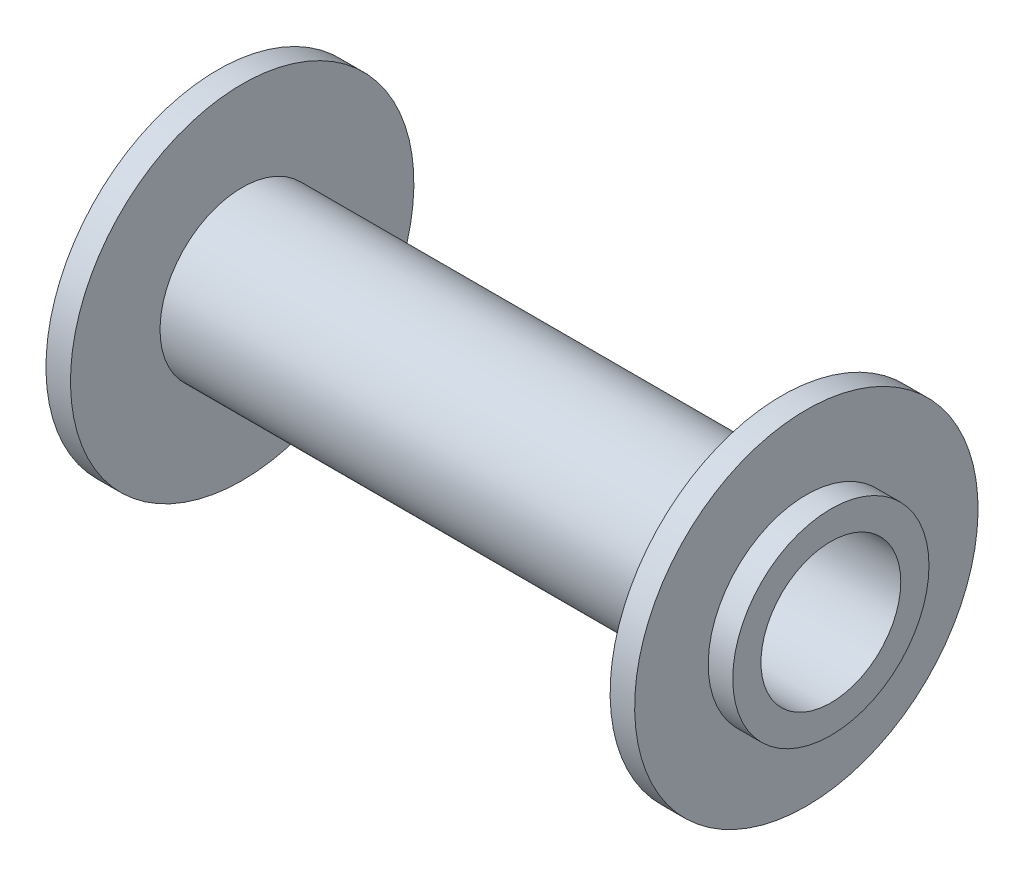
ISO-10303-21;
HEADER;
FILE_DESCRIPTION(('STEP AP214'),'2;1');
FILE_NAME('part.step','',(''),(''),'','','');
FILE_SCHEMA(('AUTOMOTIVE_DESIGN { 1 0 10303 214 1 1 1 1 }'));
ENDSEC;
DATA;
#1=APPLICATION_CONTEXT('core data for automotive mechanical design processes');
#2=APPLICATION_PROTOCOL_DEFINITION('international standard','automotive_design',2000,#1);
#3=PRODUCT_CONTEXT('',#1,'mechanical');
#4=PRODUCT('Part','Part','',(#3));
#5=PRODUCT_RELATED_PRODUCT_CATEGORY('part','',(#4));
#6=PRODUCT_DEFINITION_FORMATION('','',#4);
#7=PRODUCT_DEFINITION_CONTEXT('part definition',#1,'design');
#8=PRODUCT_DEFINITION('design','',#6,#7);
#9=PRODUCT_DEFINITION_SHAPE('','',#8);
#10=(LENGTH_UNIT() NAMED_UNIT(*) SI_UNIT(.MILLI.,.METRE.));
#11=(NAMED_UNIT(*) PLANE_ANGLE_UNIT() SI_UNIT($,.RADIAN.));
#12=(NAMED_UNIT(*) SI_UNIT($,.STERADIAN.) SOLID_ANGLE_UNIT());
#13=UNCERTAINTY_MEASURE_WITH_UNIT(LENGTH_MEASURE(1.E-05),#10,'distance_accuracy_value','');
#14=(GEOMETRIC_REPRESENTATION_CONTEXT(3) GLOBAL_UNCERTAINTY_ASSIGNED_CONTEXT((#13)) GLOBAL_UNIT_ASSIGNED_CONTEXT((#10,
#11,#12)) REPRESENTATION_CONTEXT('',''));
#15=CARTESIAN_POINT('',(0.,0.,0.));
#16=DIRECTION('',(0.,0.,1.));
#17=DIRECTION('',(1.,0.,0.));
#18=AXIS2_PLACEMENT_3D('',#15,#16,#17);
#19=CARTESIAN_POINT('',(-24.,0.,0.));
#20=DIRECTION('',(1.,0.,0.));
#21=DIRECTION('',(0.,1.,0.));
#22=AXIS2_PLACEMENT_3D('',#19,#20,#21);
#23=PLANE('',#22);
#24=CARTESIAN_POINT('',(-24.,0.,0.));
#25=DIRECTION('',(-1.,0.,0.));
#26=DIRECTION('',(0.,-1.,0.));
#27=AXIS2_PLACEMENT_3D('',#24,#25,#26);
#28=CIRCLE('',#27,14.);
#29=CARTESIAN_POINT('',(-24.,-14.,0.));
#30=VERTEX_POINT('',#29);
#31=EDGE_CURVE('E40',#30,#30,#28,.T.);
#32=ORIENTED_EDGE('',*,*,#31,.T.);
#33=EDGE_LOOP('',(#32));
#34=FACE_BOUND('',#33,.T.);
#35=CARTESIAN_POINT('',(-24.,0.,0.));
#36=DIRECTION('',(1.,0.,0.));
#37=DIRECTION('',(0.,1.,0.));
#38=AXIS2_PLACEMENT_3D('',#35,#36,#37);
#39=CIRCLE('',#38,8.);
#40=CARTESIAN_POINT('',(-24.,8.,0.));
#41=VERTEX_POINT('',#40);
#42=EDGE_CURVE('E10',#41,#41,#39,.F.);
#43=ORIENTED_EDGE('',*,*,#42,.F.);
#44=EDGE_LOOP('',(#43));
#45=FACE_BOUND('',#44,.T.);
#46=ADVANCED_FACE('F30',(#34,#45),#23,.F.);
#47=CARTESIAN_POINT('',(24.,0.,0.));
#48=DIRECTION('',(-1.,0.,0.));
#49=DIRECTION('',(0.,-1.,0.));
#50=AXIS2_PLACEMENT_3D('',#47,#48,#49);
#51=PLANE('',#50);
#52=CARTESIAN_POINT('',(24.,0.,0.));
#53=DIRECTION('',(-1.,0.,0.));
#54=DIRECTION('',(0.,-1.,0.));
#55=AXIS2_PLACEMENT_3D('',#52,#53,#54);
#56=CIRCLE('',#55,14.);
#57=CARTESIAN_POINT('',(24.,-14.,0.));
#58=VERTEX_POINT('',#57);
#59=EDGE_CURVE('E58',#58,#58,#56,.T.);
#60=ORIENTED_EDGE('',*,*,#59,.F.);
#61=EDGE_LOOP('',(#60));
#62=FACE_BOUND('',#61,.T.);
#63=CARTESIAN_POINT('',(24.,0.,0.));
#64=DIRECTION('',(-1.,0.,0.));
#65=DIRECTION('',(0.,-1.,0.));
#66=AXIS2_PLACEMENT_3D('',#63,#64,#65);
#67=CIRCLE('',#66,8.);
#68=CARTESIAN_POINT('',(24.,-8.,0.));
#69=VERTEX_POINT('',#68);
#70=EDGE_CURVE('E36',#69,#69,#67,.F.);
#71=ORIENTED_EDGE('',*,*,#70,.F.);
#72=EDGE_LOOP('',(#71));
#73=FACE_BOUND('',#72,.T.);
#74=ADVANCED_FACE('F92',(#62,#73),#51,.F.);
#75=CARTESIAN_POINT('',(-24.,0.,0.));
#76=DIRECTION('',(-1.,0.,0.));
#77=DIRECTION('',(0.,-1.,0.));
#78=AXIS2_PLACEMENT_3D('',#75,#76,#77);
#79=CYLINDRICAL_SURFACE('',#78,14.);
#80=ORIENTED_EDGE('',*,*,#31,.F.);
#81=EDGE_LOOP('',(#80));
#82=FACE_BOUND('',#81,.T.);
#83=CARTESIAN_POINT('',(-22.,0.,0.));
#84=DIRECTION('',(-1.,0.,0.));
#85=DIRECTION('',(0.,-1.,0.));
#86=AXIS2_PLACEMENT_3D('',#83,#84,#85);
#87=CIRCLE('',#86,14.);
#88=CARTESIAN_POINT('',(-22.,-14.,0.));
#89=VERTEX_POINT('',#88);
#90=EDGE_CURVE('E44',#89,#89,#87,.T.);
#91=ORIENTED_EDGE('',*,*,#90,.T.);
#92=EDGE_LOOP('',(#91));
#93=FACE_BOUND('',#92,.T.);
#94=ADVANCED_FACE('F97',(#82,#93),#79,.T.);
#95=CARTESIAN_POINT('',(-22.,14.,0.));
#96=DIRECTION('',(-1.,0.,0.));
#97=DIRECTION('',(0.,-1.,0.));
#98=AXIS2_PLACEMENT_3D('',#95,#96,#97);
#99=PLANE('',#98);
#100=ORIENTED_EDGE('',*,*,#90,.F.);
#101=EDGE_LOOP('',(#100));
#102=FACE_BOUND('',#101,.T.);
#103=CARTESIAN_POINT('',(-22.,0.,0.));
#104=DIRECTION('',(-1.,0.,0.));
#105=DIRECTION('',(0.,-1.,0.));
#106=AXIS2_PLACEMENT_3D('',#103,#104,#105);
#107=CIRCLE('',#106,6.7);
#108=CARTESIAN_POINT('',(-22.,-6.7,0.));
#109=VERTEX_POINT('',#108);
#110=EDGE_CURVE('E49',#109,#109,#107,.T.);
#111=ORIENTED_EDGE('',*,*,#110,.T.);
#112=EDGE_LOOP('',(#111));
#113=FACE_BOUND('',#112,.T.);
#114=ADVANCED_FACE('F105',(#102,#113),#99,.F.);
#115=CARTESIAN_POINT('',(-24.,0.,0.));
#116=DIRECTION('',(-1.,0.,0.));
#117=DIRECTION('',(0.,-1.,0.));
#118=AXIS2_PLACEMENT_3D('',#115,#116,#117);
#119=CYLINDRICAL_SURFACE('',#118,6.7);
#120=ORIENTED_EDGE('',*,*,#110,.F.);
#121=EDGE_LOOP('',(#120));
#122=FACE_BOUND('',#121,.T.);
#123=CARTESIAN_POINT('',(21.9999999999999,0.,0.));
#124=DIRECTION('',(-1.,0.,0.));
#125=DIRECTION('',(0.,-1.,0.));
#126=AXIS2_PLACEMENT_3D('',#123,#124,#125);
#127=CIRCLE('',#126,6.7);
#128=CARTESIAN_POINT('',(21.9999999999999,-6.69999999999999,0.));
#129=VERTEX_POINT('',#128);
#130=EDGE_CURVE('E52',#129,#129,#127,.T.);
#131=ORIENTED_EDGE('',*,*,#130,.T.);
#132=EDGE_LOOP('',(#131));
#133=FACE_BOUND('',#132,.T.);
#134=ADVANCED_FACE('F110',(#122,#133),#119,.T.);
#135=CARTESIAN_POINT('',(22.,14.,0.));
#136=DIRECTION('',(1.,0.,0.));
#137=DIRECTION('',(0.,1.,0.));
#138=AXIS2_PLACEMENT_3D('',#135,#136,#137);
#139=PLANE('',#138);
#140=ORIENTED_EDGE('',*,*,#130,.F.);
#141=EDGE_LOOP('',(#140));
#142=FACE_BOUND('',#141,.T.);
#143=CARTESIAN_POINT('',(21.9999999999999,0.,0.));
#144=DIRECTION('',(-1.,0.,0.));
#145=DIRECTION('',(0.,-1.,0.));
#146=AXIS2_PLACEMENT_3D('',#143,#144,#145);
#147=CIRCLE('',#146,14.);
#148=CARTESIAN_POINT('',(21.9999999999999,-14.,0.));
#149=VERTEX_POINT('',#148);
#150=EDGE_CURVE('E55',#149,#149,#147,.T.);
#151=ORIENTED_EDGE('',*,*,#150,.T.);
#152=EDGE_LOOP('',(#151));
#153=FACE_BOUND('',#152,.T.);
#154=ADVANCED_FACE('F116',(#142,#153),#139,.F.);
#155=CARTESIAN_POINT('',(-24.,0.,0.));
#156=DIRECTION('',(-1.,0.,0.));
#157=DIRECTION('',(0.,-1.,0.));
#158=AXIS2_PLACEMENT_3D('',#155,#156,#157);
#159=CYLINDRICAL_SURFACE('',#158,14.);
#160=ORIENTED_EDGE('',*,*,#150,.F.);
#161=EDGE_LOOP('',(#160));
#162=FACE_BOUND('',#161,.T.);
#163=ORIENTED_EDGE('',*,*,#59,.T.);
#164=EDGE_LOOP('',(#163));
#165=FACE_BOUND('',#164,.T.);
#166=ADVANCED_FACE('F122',(#162,#165),#159,.T.);
#167=CARTESIAN_POINT('',(-24.,0.,0.));
#168=DIRECTION('',(1.,0.,0.));
#169=DIRECTION('',(0.,0.,-1.));
#170=AXIS2_PLACEMENT_3D('',#167,#168,#169);
#171=CYLINDRICAL_SURFACE('',#170,5.7);
#172=CARTESIAN_POINT('',(26.,0.,0.));
#173=DIRECTION('',(1.,0.,0.));
#174=DIRECTION('',(0.,0.,-1.));
#175=AXIS2_PLACEMENT_3D('',#172,#173,#174);
#176=CIRCLE('',#175,5.7);
#177=CARTESIAN_POINT('',(26.,0.,-5.7));
#178=VERTEX_POINT('',#177);
#179=EDGE_CURVE('E64',#178,#178,#176,.T.);
#180=CARTESIAN_POINT('',(-26.,0.,0.));
#181=DIRECTION('',(-1.,0.,0.));
#182=DIRECTION('',(0.,0.,1.));
#183=AXIS2_PLACEMENT_3D('',#180,#181,#182);
#184=CIRCLE('',#183,5.7);
#185=CARTESIAN_POINT('',(-26.,0.,-5.7));
#186=VERTEX_POINT('',#185);
#187=EDGE_CURVE('E70',#186,#186,#184,.T.);
#188=CARTESIAN_POINT('',(26.,0.,-5.7));
#189=CARTESIAN_POINT('',(25.4583333333333,0.,-5.7));
#190=CARTESIAN_POINT('',(24.9166666666667,0.,-5.7));
#191=CARTESIAN_POINT('',(23.8333333333333,0.,-5.7));
#192=CARTESIAN_POINT('',(23.2916666666667,0.,-5.7));
#193=CARTESIAN_POINT('',(22.2083333333333,0.,-5.7));
#194=CARTESIAN_POINT('',(21.6666666666667,0.,-5.7));
#195=CARTESIAN_POINT('',(20.5833333333333,0.,-5.7));
#196=CARTESIAN_POINT('',(20.0416666666667,0.,-5.7));
#197=CARTESIAN_POINT('',(18.9583333333333,0.,-5.7));
#198=CARTESIAN_POINT('',(18.4166666666667,0.,-5.7));
#199=CARTESIAN_POINT('',(17.3333333333333,0.,-5.7));
#200=CARTESIAN_POINT('',(16.7916666666667,0.,-5.7));
#201=CARTESIAN_POINT('',(15.7083333333333,0.,-5.7));
#202=CARTESIAN_POINT('',(15.1666666666667,0.,-5.7));
#203=CARTESIAN_POINT('',(14.0833333333333,0.,-5.7));
#204=CARTESIAN_POINT('',(13.5416666666667,0.,-5.7));
#205=CARTESIAN_POINT('',(12.4583333333333,0.,-5.7));
#206=CARTESIAN_POINT('',(11.9166666666667,0.,-5.7));
#207=CARTESIAN_POINT('',(10.8333333333333,0.,-5.7));
#208=CARTESIAN_POINT('',(10.2916666666667,0.,-5.7));
#209=CARTESIAN_POINT('',(9.20833333333334,0.,-5.7));
#210=CARTESIAN_POINT('',(8.66666666666667,0.,-5.7));
#211=CARTESIAN_POINT('',(7.58333333333334,0.,-5.7));
#212=CARTESIAN_POINT('',(7.04166666666667,0.,-5.7));
#213=CARTESIAN_POINT('',(5.95833333333334,0.,-5.7));
#214=CARTESIAN_POINT('',(5.41666666666667,0.,-5.7));
#215=CARTESIAN_POINT('',(4.33333333333334,0.,-5.7));
#216=CARTESIAN_POINT('',(3.79166666666667,0.,-5.7));
#217=CARTESIAN_POINT('',(2.70833333333334,0.,-5.7));
#218=CARTESIAN_POINT('',(2.16666666666667,0.,-5.7));
#219=CARTESIAN_POINT('',(1.08333333333334,0.,-5.7));
#220=CARTESIAN_POINT('',(0.54166666666667,0.,-5.7));
#221=CARTESIAN_POINT('',(-0.541666666666664,0.,-5.7));
#222=CARTESIAN_POINT('',(-1.08333333333333,0.,-5.7));
#223=CARTESIAN_POINT('',(-2.16666666666666,0.,-5.7));
#224=CARTESIAN_POINT('',(-2.70833333333333,0.,-5.7));
#225=CARTESIAN_POINT('',(-3.79166666666666,0.,-5.7));
#226=CARTESIAN_POINT('',(-4.33333333333333,0.,-5.7));
#227=CARTESIAN_POINT('',(-5.41666666666666,0.,-5.7));
#228=CARTESIAN_POINT('',(-5.95833333333333,0.,-5.7));
#229=CARTESIAN_POINT('',(-7.04166666666667,0.,-5.7));
#230=CARTESIAN_POINT('',(-7.58333333333333,0.,-5.7));
#231=CARTESIAN_POINT('',(-8.66666666666667,0.,-5.7));
#232=CARTESIAN_POINT('',(-9.20833333333333,0.,-5.7));
#233=CARTESIAN_POINT('',(-10.2916666666667,0.,-5.7));
#234=CARTESIAN_POINT('',(-10.8333333333333,0.,-5.7));
#235=CARTESIAN_POINT('',(-11.9166666666667,0.,-5.7));
#236=CARTESIAN_POINT('',(-12.4583333333333,0.,-5.7));
#237=CARTESIAN_POINT('',(-13.5416666666667,0.,-5.7));
#238=CARTESIAN_POINT('',(-14.0833333333333,0.,-5.7));
#239=CARTESIAN_POINT('',(-15.1666666666667,0.,-5.7));
#240=CARTESIAN_POINT('',(-15.7083333333333,0.,-5.7));
#241=CARTESIAN_POINT('',(-16.7916666666667,0.,-5.7));
#242=CARTESIAN_POINT('',(-17.3333333333333,0.,-5.7));
#243=CARTESIAN_POINT('',(-18.4166666666667,0.,-5.7));
#244=CARTESIAN_POINT('',(-18.9583333333333,0.,-5.7));
#245=CARTESIAN_POINT('',(-20.0416666666667,0.,-5.7));
#246=CARTESIAN_POINT('',(-20.5833333333333,0.,-5.7));
#247=CARTESIAN_POINT('',(-21.6666666666667,0.,-5.7));
#248=CARTESIAN_POINT('',(-22.2083333333333,0.,-5.7));
#249=CARTESIAN_POINT('',(-23.2916666666667,0.,-5.7));
#250=CARTESIAN_POINT('',(-23.8333333333333,0.,-5.7));
#251=CARTESIAN_POINT('',(-24.9166666666667,0.,-5.7));
#252=CARTESIAN_POINT('',(-25.4583333333333,0.,-5.7));
#253=CARTESIAN_POINT('',(-26.,0.,-5.7));
#254=B_SPLINE_CURVE_WITH_KNOTS('',3,(#188,#189,#190,#191,#192,#193,#194,#195,#196,#197,#198,
#199,#200,#201,#202,#203,#204,#205,#206,#207,#208,#209,#210,#211,#212,#213,#214,#215,#216,#217,
#218,#219,#220,#221,#222,#223,#224,#225,#226,#227,#228,#229,#230,#231,#232,#233,#234,#235,#236,
#237,#238,#239,#240,#241,#242,#243,#244,#245,#246,#247,#248,#249,#250,#251,#252,#253),
.UNSPECIFIED.,.F.,.F.,(4,2,2,2,2,2,2,2,2,2,2,2,2,2,2,2,2,2,2,2,2,2,2,2,2,2,2,2,2,2,2,2,4),(0.,
1.625,3.25,4.875,6.5,8.125,9.75,11.375,13.,14.625,16.25,17.875,19.5,21.125,22.75,24.375,26.,
27.625,29.25,30.875,32.5,34.125,35.75,37.375,39.,40.625,42.25,43.875,45.5,47.125,48.75,50.375,
52.),.UNSPECIFIED.);
#255=EDGE_CURVE('BSEAM74',#178,#186,#254,.T.);
#256=ORIENTED_EDGE('',*,*,#179,.T.);
#257=ORIENTED_EDGE('',*,*,#187,.T.);
#258=ORIENTED_EDGE('',*,*,#255,.T.);
#259=ORIENTED_EDGE('',*,*,#255,.F.);
#260=EDGE_LOOP('',(#256,#258,#257,#259));
#261=FACE_BOUND('',#260,.T.);
#262=ADVANCED_FACE('F74',(#261),#171,.F.);
#263=CARTESIAN_POINT('',(26.,0.,0.));
#264=DIRECTION('',(1.,0.,0.));
#265=DIRECTION('',(0.,0.,-1.));
#266=AXIS2_PLACEMENT_3D('',#263,#264,#265);
#267=PLANE('',#266);
#268=CARTESIAN_POINT('',(26.,0.,0.));
#269=DIRECTION('',(1.,0.,0.));
#270=DIRECTION('',(0.,0.,-1.));
#271=AXIS2_PLACEMENT_3D('',#268,#269,#270);
#272=CIRCLE('',#271,8.);
#273=CARTESIAN_POINT('',(26.,0.,-8.));
#274=VERTEX_POINT('',#273);
#275=EDGE_CURVE('E61',#274,#274,#272,.T.);
#276=ORIENTED_EDGE('',*,*,#275,.T.);
#277=EDGE_LOOP('',(#276));
#278=FACE_BOUND('',#277,.T.);
#279=ORIENTED_EDGE('',*,*,#179,.F.);
#280=EDGE_LOOP('',(#279));
#281=FACE_BOUND('',#280,.T.);
#282=ADVANCED_FACE('F88',(#278,#281),#267,.T.);
#283=CARTESIAN_POINT('',(26.,0.,0.));
#284=DIRECTION('',(-1.,0.,0.));
#285=DIRECTION('',(0.,0.,1.));
#286=AXIS2_PLACEMENT_3D('',#283,#284,#285);
#287=CYLINDRICAL_SURFACE('',#286,8.);
#288=ORIENTED_EDGE('',*,*,#275,.F.);
#289=EDGE_LOOP('',(#288));
#290=FACE_BOUND('',#289,.T.);
#291=ORIENTED_EDGE('',*,*,#70,.T.);
#292=EDGE_LOOP('',(#291));
#293=FACE_BOUND('',#292,.T.);
#294=ADVANCED_FACE('F79',(#290,#293),#287,.T.);
#295=CARTESIAN_POINT('',(-26.,0.,0.));
#296=DIRECTION('',(-1.,0.,0.));
#297=DIRECTION('',(0.,0.,1.));
#298=AXIS2_PLACEMENT_3D('',#295,#296,#297);
#299=PLANE('',#298);
#300=CARTESIAN_POINT('',(-26.,0.,0.));
#301=DIRECTION('',(-1.,0.,0.));
#302=DIRECTION('',(0.,0.,1.));
#303=AXIS2_PLACEMENT_3D('',#300,#301,#302);
#304=CIRCLE('',#303,8.);
#305=CARTESIAN_POINT('',(-26.,0.,8.));
#306=VERTEX_POINT('',#305);
#307=EDGE_CURVE('E67',#306,#306,#304,.T.);
#308=ORIENTED_EDGE('',*,*,#307,.T.);
#309=EDGE_LOOP('',(#308));
#310=FACE_BOUND('',#309,.T.);
#311=ORIENTED_EDGE('',*,*,#187,.F.);
#312=EDGE_LOOP('',(#311));
#313=FACE_BOUND('',#312,.T.);
#314=ADVANCED_FACE('F76',(#310,#313),#299,.T.);
#315=CARTESIAN_POINT('',(-26.,0.,0.));
#316=DIRECTION('',(1.,0.,0.));
#317=DIRECTION('',(0.,0.,-1.));
#318=AXIS2_PLACEMENT_3D('',#315,#316,#317);
#319=CYLINDRICAL_SURFACE('',#318,8.);
#320=ORIENTED_EDGE('',*,*,#307,.F.);
#321=EDGE_LOOP('',(#320));
#322=FACE_BOUND('',#321,.T.);
#323=ORIENTED_EDGE('',*,*,#42,.T.);
#324=EDGE_LOOP('',(#323));
#325=FACE_BOUND('',#324,.T.);
#326=ADVANCED_FACE('F78',(#322,#325),#319,.T.);
#327=CLOSED_SHELL('',(#46,#74,#94,#114,#134,#154,#166,#262,#282,#294,#314,#326));
#328=MANIFOLD_SOLID_BREP('B2',#327);
#329=ADVANCED_BREP_SHAPE_REPRESENTATION('',(#18,#328),#14);
#330=SHAPE_DEFINITION_REPRESENTATION(#9,#329);
ENDSEC;
END-ISO-10303-21;
